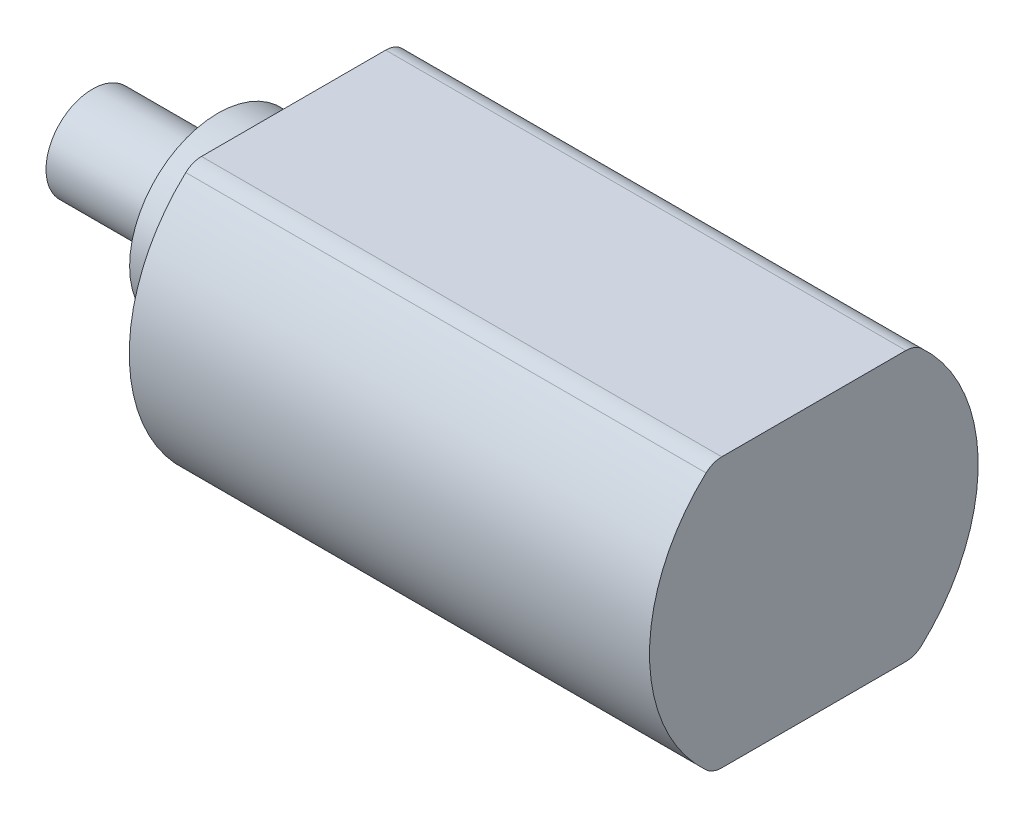
ISO-10303-21;
HEADER;
FILE_DESCRIPTION(('STEP AP214'),'2;1');
FILE_NAME('part.step','',(''),(''),'','','');
FILE_SCHEMA(('AUTOMOTIVE_DESIGN { 1 0 10303 214 1 1 1 1 }'));
ENDSEC;
DATA;
#1=APPLICATION_CONTEXT('core data for automotive mechanical design processes');
#2=APPLICATION_PROTOCOL_DEFINITION('international standard','automotive_design',2000,#1);
#3=PRODUCT_CONTEXT('',#1,'mechanical');
#4=PRODUCT('Part','Part','',(#3));
#5=PRODUCT_RELATED_PRODUCT_CATEGORY('part','',(#4));
#6=PRODUCT_DEFINITION_FORMATION('','',#4);
#7=PRODUCT_DEFINITION_CONTEXT('part definition',#1,'design');
#8=PRODUCT_DEFINITION('design','',#6,#7);
#9=PRODUCT_DEFINITION_SHAPE('','',#8);
#10=(LENGTH_UNIT() NAMED_UNIT(*) SI_UNIT(.MILLI.,.METRE.));
#11=(NAMED_UNIT(*) PLANE_ANGLE_UNIT() SI_UNIT($,.RADIAN.));
#12=(NAMED_UNIT(*) SI_UNIT($,.STERADIAN.) SOLID_ANGLE_UNIT());
#13=UNCERTAINTY_MEASURE_WITH_UNIT(LENGTH_MEASURE(1.E-05),#10,'distance_accuracy_value','');
#14=(GEOMETRIC_REPRESENTATION_CONTEXT(3) GLOBAL_UNCERTAINTY_ASSIGNED_CONTEXT((#13)) GLOBAL_UNIT_ASSIGNED_CONTEXT((#10,
#11,#12)) REPRESENTATION_CONTEXT('',''));
#15=CARTESIAN_POINT('',(0.,0.,0.));
#16=DIRECTION('',(0.,0.,1.));
#17=DIRECTION('',(1.,0.,0.));
#18=AXIS2_PLACEMENT_3D('',#15,#16,#17);
#19=CARTESIAN_POINT('',(56.896,0.,-1.116383700712));
#20=DIRECTION('',(-1.,0.,0.));
#21=DIRECTION('',(0.,0.,1.));
#22=AXIS2_PLACEMENT_3D('',#19,#20,#21);
#23=CYLINDRICAL_SURFACE('',#22,19.086883700712);
#24=CARTESIAN_POINT('',(56.896,0.,-1.116383700712));
#25=DIRECTION('',(1.,0.,0.));
#26=DIRECTION('',(0.,0.,-1.));
#27=AXIS2_PLACEMENT_3D('',#24,#25,#26);
#28=CIRCLE('',#27,19.086883700712);
#29=CARTESIAN_POINT('',(56.896,14.0635113105356,11.7881418241937));
#30=VERTEX_POINT('',#29);
#31=CARTESIAN_POINT('',(56.896,-14.0635113105356,11.7881418241937));
#32=VERTEX_POINT('',#31);
#33=EDGE_CURVE('E136',#30,#32,#28,.T.);
#34=ORIENTED_EDGE('',*,*,#33,.F.);
#35=DIRECTION('',(-1.,0.,0.));
#36=VECTOR('',#35,1.);
#37=CARTESIAN_POINT('',(56.896,14.0635113105356,11.7881418241937));
#38=LINE('',#37,#36);
#39=CARTESIAN_POINT('',(0.,14.0635113105356,11.7881418241937));
#40=VERTEX_POINT('',#39);
#41=EDGE_CURVE('E148',#30,#40,#38,.T.);
#42=ORIENTED_EDGE('',*,*,#41,.T.);
#43=CARTESIAN_POINT('',(0.,0.,-1.116383700712));
#44=DIRECTION('',(1.,0.,0.));
#45=DIRECTION('',(0.,0.,-1.));
#46=AXIS2_PLACEMENT_3D('',#43,#44,#45);
#47=CIRCLE('',#46,19.086883700712);
#48=CARTESIAN_POINT('',(0.,-14.0635113105356,11.7881418241937));
#49=VERTEX_POINT('',#48);
#50=EDGE_CURVE('E127',#40,#49,#47,.T.);
#51=ORIENTED_EDGE('',*,*,#50,.T.);
#52=DIRECTION('',(-1.,0.,0.));
#53=VECTOR('',#52,1.);
#54=CARTESIAN_POINT('',(56.896,-14.0635113105356,11.7881418241937));
#55=LINE('',#54,#53);
#56=EDGE_CURVE('E108',#49,#32,#55,.F.);
#57=ORIENTED_EDGE('',*,*,#56,.T.);
#58=EDGE_LOOP('',(#34,#42,#51,#57));
#59=FACE_BOUND('',#58,.T.);
#60=ADVANCED_FACE('F33',(#59),#23,.T.);
#61=CARTESIAN_POINT('',(56.896,-14.732,11.0194024462381));
#62=DIRECTION('',(0.,1.,0.));
#63=DIRECTION('',(0.,0.,1.));
#64=AXIS2_PLACEMENT_3D('',#61,#62,#63);
#65=PLANE('',#64);
#66=DIRECTION('',(0.,0.,-1.));
#67=VECTOR('',#66,1.);
#68=CARTESIAN_POINT('',(56.896,-14.732,11.0194024462381));
#69=LINE('',#68,#67);
#70=CARTESIAN_POINT('',(56.896,-14.732,10.070863333518));
#71=VERTEX_POINT('',#70);
#72=CARTESIAN_POINT('',(56.896,-14.732,-10.070863333518));
#73=VERTEX_POINT('',#72);
#74=EDGE_CURVE('E121',#71,#73,#69,.T.);
#75=ORIENTED_EDGE('',*,*,#74,.F.);
#76=DIRECTION('',(-1.,0.,0.));
#77=VECTOR('',#76,1.);
#78=CARTESIAN_POINT('',(56.896,-14.732,10.070863333518));
#79=LINE('',#78,#77);
#80=CARTESIAN_POINT('',(0.,-14.732,10.070863333518));
#81=VERTEX_POINT('',#80);
#82=EDGE_CURVE('E106',#71,#81,#79,.T.);
#83=ORIENTED_EDGE('',*,*,#82,.T.);
#84=DIRECTION('',(0.,0.,-1.));
#85=VECTOR('',#84,1.);
#86=CARTESIAN_POINT('',(0.,-14.732,11.0194024462381));
#87=LINE('',#86,#85);
#88=CARTESIAN_POINT('',(0.,-14.732,-10.070863333518));
#89=VERTEX_POINT('',#88);
#90=EDGE_CURVE('E118',#81,#89,#87,.T.);
#91=ORIENTED_EDGE('',*,*,#90,.T.);
#92=DIRECTION('',(-1.,0.,0.));
#93=VECTOR('',#92,1.);
#94=CARTESIAN_POINT('',(56.896,-14.732,-10.070863333518));
#95=LINE('',#94,#93);
#96=EDGE_CURVE('E122',#89,#73,#95,.F.);
#97=ORIENTED_EDGE('',*,*,#96,.T.);
#98=EDGE_LOOP('',(#75,#83,#91,#97));
#99=FACE_BOUND('',#98,.T.);
#100=ADVANCED_FACE('F117',(#99),#65,.F.);
#101=CARTESIAN_POINT('',(56.896,0.,1.116383700712));
#102=DIRECTION('',(-1.,0.,0.));
#103=DIRECTION('',(0.,0.,1.));
#104=AXIS2_PLACEMENT_3D('',#101,#102,#103);
#105=CYLINDRICAL_SURFACE('',#104,19.086883700712);
#106=CARTESIAN_POINT('',(0.,0.,1.116383700712));
#107=DIRECTION('',(1.,0.,0.));
#108=DIRECTION('',(0.,0.,1.));
#109=AXIS2_PLACEMENT_3D('',#106,#107,#108);
#110=CIRCLE('',#109,19.086883700712);
#111=CARTESIAN_POINT('',(0.,-14.0635113105356,-11.7881418241937));
#112=VERTEX_POINT('',#111);
#113=CARTESIAN_POINT('',(0.,14.0635113105356,-11.7881418241937));
#114=VERTEX_POINT('',#113);
#115=EDGE_CURVE('E126',#112,#114,#110,.T.);
#116=ORIENTED_EDGE('',*,*,#115,.T.);
#117=DIRECTION('',(-1.,0.,0.));
#118=VECTOR('',#117,1.);
#119=CARTESIAN_POINT('',(56.896,14.0635113105356,-11.7881418241937));
#120=LINE('',#119,#118);
#121=CARTESIAN_POINT('',(56.896,14.0635113105356,-11.7881418241937));
#122=VERTEX_POINT('',#121);
#123=EDGE_CURVE('E41',#114,#122,#120,.F.);
#124=ORIENTED_EDGE('',*,*,#123,.T.);
#125=CARTESIAN_POINT('',(56.896,0.,1.116383700712));
#126=DIRECTION('',(1.,0.,0.));
#127=DIRECTION('',(0.,0.,1.));
#128=AXIS2_PLACEMENT_3D('',#125,#126,#127);
#129=CIRCLE('',#128,19.086883700712);
#130=CARTESIAN_POINT('',(56.896,-14.0635113105356,-11.7881418241937));
#131=VERTEX_POINT('',#130);
#132=EDGE_CURVE('E178',#131,#122,#129,.T.);
#133=ORIENTED_EDGE('',*,*,#132,.F.);
#134=DIRECTION('',(-1.,0.,0.));
#135=VECTOR('',#134,1.);
#136=CARTESIAN_POINT('',(56.896,-14.0635113105356,-11.7881418241937));
#137=LINE('',#136,#135);
#138=EDGE_CURVE('E145',#131,#112,#137,.T.);
#139=ORIENTED_EDGE('',*,*,#138,.T.);
#140=EDGE_LOOP('',(#116,#124,#133,#139));
#141=FACE_BOUND('',#140,.T.);
#142=ADVANCED_FACE('F176',(#141),#105,.T.);
#143=CARTESIAN_POINT('',(56.896,14.732,11.0194024462381));
#144=DIRECTION('',(0.,-1.,0.));
#145=DIRECTION('',(0.,0.,-1.));
#146=AXIS2_PLACEMENT_3D('',#143,#144,#145);
#147=PLANE('',#146);
#148=DIRECTION('',(0.,0.,1.));
#149=VECTOR('',#148,1.);
#150=CARTESIAN_POINT('',(0.,14.732,11.0194024462381));
#151=LINE('',#150,#149);
#152=CARTESIAN_POINT('',(0.,14.732,-10.070863333518));
#153=VERTEX_POINT('',#152);
#154=CARTESIAN_POINT('',(0.,14.732,10.070863333518));
#155=VERTEX_POINT('',#154);
#156=EDGE_CURVE('E129',#153,#155,#151,.T.);
#157=ORIENTED_EDGE('',*,*,#156,.T.);
#158=DIRECTION('',(-1.,0.,0.));
#159=VECTOR('',#158,1.);
#160=CARTESIAN_POINT('',(56.896,14.732,10.070863333518));
#161=LINE('',#160,#159);
#162=CARTESIAN_POINT('',(56.896,14.732,10.070863333518));
#163=VERTEX_POINT('',#162);
#164=EDGE_CURVE('E55',#155,#163,#161,.F.);
#165=ORIENTED_EDGE('',*,*,#164,.T.);
#166=DIRECTION('',(0.,0.,1.));
#167=VECTOR('',#166,1.);
#168=CARTESIAN_POINT('',(56.896,14.732,11.0194024462381));
#169=LINE('',#168,#167);
#170=CARTESIAN_POINT('',(56.896,14.732,-10.070863333518));
#171=VERTEX_POINT('',#170);
#172=EDGE_CURVE('E137',#171,#163,#169,.T.);
#173=ORIENTED_EDGE('',*,*,#172,.F.);
#174=DIRECTION('',(-1.,0.,0.));
#175=VECTOR('',#174,1.);
#176=CARTESIAN_POINT('',(56.896,14.732,-10.070863333518));
#177=LINE('',#176,#175);
#178=EDGE_CURVE('E155',#171,#153,#177,.T.);
#179=ORIENTED_EDGE('',*,*,#178,.T.);
#180=EDGE_LOOP('',(#157,#165,#173,#179));
#181=FACE_BOUND('',#180,.T.);
#182=ADVANCED_FACE('F172',(#181),#147,.F.);
#183=CARTESIAN_POINT('',(56.896,0.,-1.116383700712));
#184=DIRECTION('',(1.,0.,0.));
#185=DIRECTION('',(0.,0.,-1.));
#186=AXIS2_PLACEMENT_3D('',#183,#184,#185);
#187=PLANE('',#186);
#188=ORIENTED_EDGE('',*,*,#172,.T.);
#189=CARTESIAN_POINT('',(56.896,12.192,10.070863333518));
#190=DIRECTION('',(1.,0.,0.));
#191=DIRECTION('',(0.,0.,-1.));
#192=AXIS2_PLACEMENT_3D('',#189,#190,#191);
#193=CIRCLE('',#192,2.54);
#194=EDGE_CURVE('E161',#163,#30,#193,.T.);
#195=ORIENTED_EDGE('',*,*,#194,.T.);
#196=ORIENTED_EDGE('',*,*,#33,.T.);
#197=CARTESIAN_POINT('',(56.896,-12.192,10.070863333518));
#198=DIRECTION('',(1.,0.,0.));
#199=DIRECTION('',(0.,0.,-1.));
#200=AXIS2_PLACEMENT_3D('',#197,#198,#199);
#201=CIRCLE('',#200,2.54);
#202=EDGE_CURVE('E143',#32,#71,#201,.T.);
#203=ORIENTED_EDGE('',*,*,#202,.T.);
#204=ORIENTED_EDGE('',*,*,#74,.T.);
#205=CARTESIAN_POINT('',(56.896,-12.192,-10.070863333518));
#206=DIRECTION('',(1.,0.,0.));
#207=DIRECTION('',(0.,0.,-1.));
#208=AXIS2_PLACEMENT_3D('',#205,#206,#207);
#209=CIRCLE('',#208,2.54);
#210=EDGE_CURVE('E141',#73,#131,#209,.T.);
#211=ORIENTED_EDGE('',*,*,#210,.T.);
#212=ORIENTED_EDGE('',*,*,#132,.T.);
#213=CARTESIAN_POINT('',(56.896,12.192,-10.070863333518));
#214=DIRECTION('',(1.,0.,0.));
#215=DIRECTION('',(0.,0.,-1.));
#216=AXIS2_PLACEMENT_3D('',#213,#214,#215);
#217=CIRCLE('',#216,2.54);
#218=EDGE_CURVE('E159',#122,#171,#217,.T.);
#219=ORIENTED_EDGE('',*,*,#218,.T.);
#220=EDGE_LOOP('',(#188,#195,#196,#203,#204,#211,#212,#219));
#221=FACE_BOUND('',#220,.T.);
#222=ADVANCED_FACE('F165',(#221),#187,.T.);
#223=CARTESIAN_POINT('',(0.,0.,-1.116383700712));
#224=DIRECTION('',(1.,0.,0.));
#225=DIRECTION('',(0.,0.,-1.));
#226=AXIS2_PLACEMENT_3D('',#223,#224,#225);
#227=PLANE('',#226);
#228=CARTESIAN_POINT('',(0.,0.,0.));
#229=DIRECTION('',(1.,0.,0.));
#230=DIRECTION('',(0.,0.,-1.));
#231=AXIS2_PLACEMENT_3D('',#228,#229,#230);
#232=CIRCLE('',#231,9.652);
#233=CARTESIAN_POINT('',(0.,0.,-9.652));
#234=VERTEX_POINT('',#233);
#235=EDGE_CURVE('E11',#234,#234,#232,.F.);
#236=ORIENTED_EDGE('',*,*,#235,.F.);
#237=EDGE_LOOP('',(#236));
#238=FACE_BOUND('',#237,.T.);
#239=ORIENTED_EDGE('',*,*,#50,.F.);
#240=CARTESIAN_POINT('',(0.,12.192,10.070863333518));
#241=DIRECTION('',(1.,0.,0.));
#242=DIRECTION('',(0.,0.,-1.));
#243=AXIS2_PLACEMENT_3D('',#240,#241,#242);
#244=CIRCLE('',#243,2.54);
#245=EDGE_CURVE('E153',#40,#155,#244,.F.);
#246=ORIENTED_EDGE('',*,*,#245,.T.);
#247=ORIENTED_EDGE('',*,*,#156,.F.);
#248=CARTESIAN_POINT('',(0.,12.192,-10.070863333518));
#249=DIRECTION('',(1.,0.,0.));
#250=DIRECTION('',(0.,0.,-1.));
#251=AXIS2_PLACEMENT_3D('',#248,#249,#250);
#252=CIRCLE('',#251,2.54);
#253=EDGE_CURVE('E151',#153,#114,#252,.F.);
#254=ORIENTED_EDGE('',*,*,#253,.T.);
#255=ORIENTED_EDGE('',*,*,#115,.F.);
#256=CARTESIAN_POINT('',(0.,-12.192,-10.070863333518));
#257=DIRECTION('',(1.,0.,0.));
#258=DIRECTION('',(0.,0.,-1.));
#259=AXIS2_PLACEMENT_3D('',#256,#257,#258);
#260=CIRCLE('',#259,2.54);
#261=EDGE_CURVE('E112',#112,#89,#260,.F.);
#262=ORIENTED_EDGE('',*,*,#261,.T.);
#263=ORIENTED_EDGE('',*,*,#90,.F.);
#264=CARTESIAN_POINT('',(0.,-12.192,10.070863333518));
#265=DIRECTION('',(1.,0.,0.));
#266=DIRECTION('',(0.,0.,-1.));
#267=AXIS2_PLACEMENT_3D('',#264,#265,#266);
#268=CIRCLE('',#267,2.54);
#269=EDGE_CURVE('E102',#81,#49,#268,.F.);
#270=ORIENTED_EDGE('',*,*,#269,.T.);
#271=EDGE_LOOP('',(#239,#246,#247,#254,#255,#262,#263,#270));
#272=FACE_BOUND('',#271,.T.);
#273=ADVANCED_FACE('F124',(#238,#272),#227,.F.);
#274=CARTESIAN_POINT('',(56.896,-12.192,10.070863333518));
#275=DIRECTION('',(-1.,0.,0.));
#276=DIRECTION('',(0.,0.,1.));
#277=AXIS2_PLACEMENT_3D('',#274,#275,#276);
#278=CYLINDRICAL_SURFACE('',#277,2.54);
#279=ORIENTED_EDGE('',*,*,#202,.F.);
#280=ORIENTED_EDGE('',*,*,#56,.F.);
#281=ORIENTED_EDGE('',*,*,#269,.F.);
#282=ORIENTED_EDGE('',*,*,#82,.F.);
#283=EDGE_LOOP('',(#279,#280,#281,#282));
#284=FACE_BOUND('',#283,.T.);
#285=ADVANCED_FACE('F105',(#284),#278,.T.);
#286=CARTESIAN_POINT('',(56.896,-12.192,-10.070863333518));
#287=DIRECTION('',(-1.,0.,0.));
#288=DIRECTION('',(0.,0.,1.));
#289=AXIS2_PLACEMENT_3D('',#286,#287,#288);
#290=CYLINDRICAL_SURFACE('',#289,2.54);
#291=ORIENTED_EDGE('',*,*,#210,.F.);
#292=ORIENTED_EDGE('',*,*,#96,.F.);
#293=ORIENTED_EDGE('',*,*,#261,.F.);
#294=ORIENTED_EDGE('',*,*,#138,.F.);
#295=EDGE_LOOP('',(#291,#292,#293,#294));
#296=FACE_BOUND('',#295,.T.);
#297=ADVANCED_FACE('F181',(#296),#290,.T.);
#298=CARTESIAN_POINT('',(56.896,12.192,10.070863333518));
#299=DIRECTION('',(-1.,0.,0.));
#300=DIRECTION('',(0.,0.,1.));
#301=AXIS2_PLACEMENT_3D('',#298,#299,#300);
#302=CYLINDRICAL_SURFACE('',#301,2.54);
#303=ORIENTED_EDGE('',*,*,#194,.F.);
#304=ORIENTED_EDGE('',*,*,#164,.F.);
#305=ORIENTED_EDGE('',*,*,#245,.F.);
#306=ORIENTED_EDGE('',*,*,#41,.F.);
#307=EDGE_LOOP('',(#303,#304,#305,#306));
#308=FACE_BOUND('',#307,.T.);
#309=ADVANCED_FACE('F170',(#308),#302,.T.);
#310=CARTESIAN_POINT('',(56.896,12.192,-10.070863333518));
#311=DIRECTION('',(-1.,0.,0.));
#312=DIRECTION('',(0.,0.,1.));
#313=AXIS2_PLACEMENT_3D('',#310,#311,#312);
#314=CYLINDRICAL_SURFACE('',#313,2.54);
#315=ORIENTED_EDGE('',*,*,#218,.F.);
#316=ORIENTED_EDGE('',*,*,#123,.F.);
#317=ORIENTED_EDGE('',*,*,#253,.F.);
#318=ORIENTED_EDGE('',*,*,#178,.F.);
#319=EDGE_LOOP('',(#315,#316,#317,#318));
#320=FACE_BOUND('',#319,.T.);
#321=ADVANCED_FACE('F35',(#320),#314,.T.);
#322=CARTESIAN_POINT('',(-8.2804,0.,0.));
#323=DIRECTION('',(1.,0.,0.));
#324=DIRECTION('',(0.,0.,-1.));
#325=AXIS2_PLACEMENT_3D('',#322,#323,#324);
#326=CYLINDRICAL_SURFACE('',#325,9.652);
#327=CARTESIAN_POINT('',(-8.2804,0.,0.));
#328=DIRECTION('',(-1.,0.,0.));
#329=DIRECTION('',(0.,0.,1.));
#330=AXIS2_PLACEMENT_3D('',#327,#328,#329);
#331=CIRCLE('',#330,9.652);
#332=CARTESIAN_POINT('',(-8.2804,0.,9.652));
#333=VERTEX_POINT('',#332);
#334=EDGE_CURVE('E131',#333,#333,#331,.T.);
#335=ORIENTED_EDGE('',*,*,#334,.F.);
#336=EDGE_LOOP('',(#335));
#337=FACE_BOUND('',#336,.T.);
#338=ORIENTED_EDGE('',*,*,#235,.T.);
#339=EDGE_LOOP('',(#338));
#340=FACE_BOUND('',#339,.T.);
#341=ADVANCED_FACE('F205',(#337,#340),#326,.T.);
#342=CARTESIAN_POINT('',(-8.2804,0.,0.));
#343=DIRECTION('',(-1.,0.,0.));
#344=DIRECTION('',(0.,0.,1.));
#345=AXIS2_PLACEMENT_3D('',#342,#343,#344);
#346=PLANE('',#345);
#347=CARTESIAN_POINT('',(-8.2804,0.,0.));
#348=DIRECTION('',(-1.,0.,0.));
#349=DIRECTION('',(0.,0.,1.));
#350=AXIS2_PLACEMENT_3D('',#347,#348,#349);
#351=CIRCLE('',#350,5.08);
#352=CARTESIAN_POINT('',(-8.2804,0.,5.08));
#353=VERTEX_POINT('',#352);
#354=EDGE_CURVE('E188',#353,#353,#351,.T.);
#355=ORIENTED_EDGE('',*,*,#354,.F.);
#356=EDGE_LOOP('',(#355));
#357=FACE_BOUND('',#356,.T.);
#358=ORIENTED_EDGE('',*,*,#334,.T.);
#359=EDGE_LOOP('',(#358));
#360=FACE_BOUND('',#359,.T.);
#361=ADVANCED_FACE('F199',(#357,#360),#346,.T.);
#362=CARTESIAN_POINT('',(-21.9964,0.,0.));
#363=DIRECTION('',(1.,0.,0.));
#364=DIRECTION('',(0.,0.,-1.));
#365=AXIS2_PLACEMENT_3D('',#362,#363,#364);
#366=CYLINDRICAL_SURFACE('',#365,5.08);
#367=CARTESIAN_POINT('',(-21.9964,0.,0.));
#368=DIRECTION('',(-1.,0.,0.));
#369=DIRECTION('',(0.,0.,1.));
#370=AXIS2_PLACEMENT_3D('',#367,#368,#369);
#371=CIRCLE('',#370,5.08);
#372=CARTESIAN_POINT('',(-21.9964,0.,5.08));
#373=VERTEX_POINT('',#372);
#374=EDGE_CURVE('E187',#373,#373,#371,.T.);
#375=ORIENTED_EDGE('',*,*,#374,.F.);
#376=EDGE_LOOP('',(#375));
#377=FACE_BOUND('',#376,.T.);
#378=ORIENTED_EDGE('',*,*,#354,.T.);
#379=EDGE_LOOP('',(#378));
#380=FACE_BOUND('',#379,.T.);
#381=ADVANCED_FACE('F196',(#377,#380),#366,.T.);
#382=CARTESIAN_POINT('',(-21.9964,0.,0.));
#383=DIRECTION('',(-1.,0.,0.));
#384=DIRECTION('',(0.,0.,1.));
#385=AXIS2_PLACEMENT_3D('',#382,#383,#384);
#386=PLANE('',#385);
#387=ORIENTED_EDGE('',*,*,#374,.T.);
#388=EDGE_LOOP('',(#387));
#389=FACE_BOUND('',#388,.T.);
#390=ADVANCED_FACE('F194',(#389),#386,.T.);
#391=CLOSED_SHELL('',(#60,#100,#142,#182,#222,#273,#285,#297,#309,#321,#341,#361,#381,#390));
#392=MANIFOLD_SOLID_BREP('B2',#391);
#393=ADVANCED_BREP_SHAPE_REPRESENTATION('',(#18,#392),#14);
#394=SHAPE_DEFINITION_REPRESENTATION(#9,#393);
ENDSEC;
END-ISO-10303-21;
